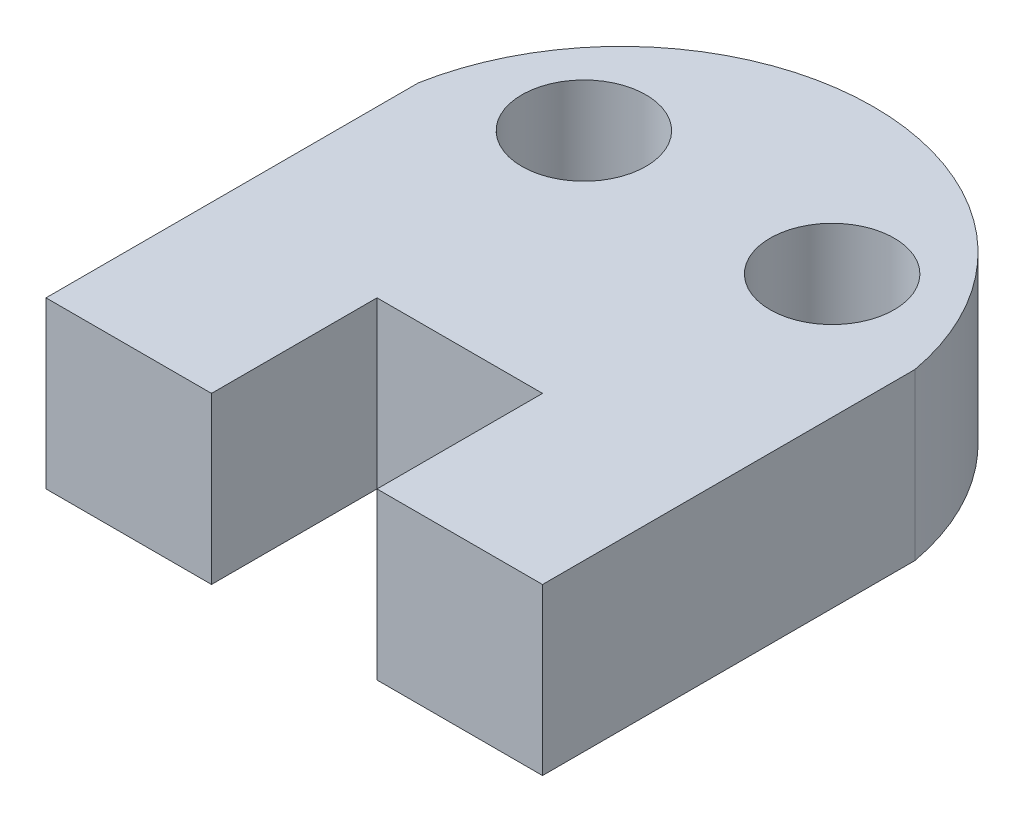
ISO-10303-21;
HEADER;
FILE_DESCRIPTION(('STEP AP214'),'2;1');
FILE_NAME('part.step','',(''),(''),'','','');
FILE_SCHEMA(('AUTOMOTIVE_DESIGN { 1 0 10303 214 1 1 1 1 }'));
ENDSEC;
DATA;
#1=APPLICATION_CONTEXT('core data for automotive mechanical design processes');
#2=APPLICATION_PROTOCOL_DEFINITION('international standard','automotive_design',2000,#1);
#3=PRODUCT_CONTEXT('',#1,'mechanical');
#4=PRODUCT('Part','Part','',(#3));
#5=PRODUCT_RELATED_PRODUCT_CATEGORY('part','',(#4));
#6=PRODUCT_DEFINITION_FORMATION('','',#4);
#7=PRODUCT_DEFINITION_CONTEXT('part definition',#1,'design');
#8=PRODUCT_DEFINITION('design','',#6,#7);
#9=PRODUCT_DEFINITION_SHAPE('','',#8);
#10=(LENGTH_UNIT() NAMED_UNIT(*) SI_UNIT(.MILLI.,.METRE.));
#11=(NAMED_UNIT(*) PLANE_ANGLE_UNIT() SI_UNIT($,.RADIAN.));
#12=(NAMED_UNIT(*) SI_UNIT($,.STERADIAN.) SOLID_ANGLE_UNIT());
#13=UNCERTAINTY_MEASURE_WITH_UNIT(LENGTH_MEASURE(1.E-05),#10,'distance_accuracy_value','');
#14=(GEOMETRIC_REPRESENTATION_CONTEXT(3) GLOBAL_UNCERTAINTY_ASSIGNED_CONTEXT((#13)) GLOBAL_UNIT_ASSIGNED_CONTEXT((#10,
#11,#12)) REPRESENTATION_CONTEXT('',''));
#15=CARTESIAN_POINT('',(0.,0.,0.));
#16=DIRECTION('',(0.,0.,1.));
#17=DIRECTION('',(1.,0.,0.));
#18=AXIS2_PLACEMENT_3D('',#15,#16,#17);
#19=CARTESIAN_POINT('',(0.,4.,0.));
#20=DIRECTION('',(0.,1.,0.));
#21=DIRECTION('',(0.,0.,1.));
#22=AXIS2_PLACEMENT_3D('',#19,#20,#21);
#23=PLANE('',#22);
#24=CARTESIAN_POINT('',(-3.,4.,-0.999999999999999));
#25=DIRECTION('',(0.,1.,0.));
#26=DIRECTION('',(0.,0.,1.));
#27=AXIS2_PLACEMENT_3D('',#24,#25,#26);
#28=CIRCLE('',#27,1.5);
#29=CARTESIAN_POINT('',(-3.,4.,0.500000000000001));
#30=VERTEX_POINT('',#29);
#31=EDGE_CURVE('E207',#30,#30,#28,.T.);
#32=ORIENTED_EDGE('',*,*,#31,.F.);
#33=EDGE_LOOP('',(#32));
#34=FACE_BOUND('',#33,.T.);
#35=CARTESIAN_POINT('',(3.,4.,-0.999999999999999));
#36=DIRECTION('',(0.,1.,0.));
#37=DIRECTION('',(0.,0.,1.));
#38=AXIS2_PLACEMENT_3D('',#35,#36,#37);
#39=CIRCLE('',#38,1.5);
#40=CARTESIAN_POINT('',(3.,4.,0.5));
#41=VERTEX_POINT('',#40);
#42=EDGE_CURVE('E184',#41,#41,#39,.T.);
#43=ORIENTED_EDGE('',*,*,#42,.F.);
#44=EDGE_LOOP('',(#43));
#45=FACE_BOUND('',#44,.T.);
#46=DIRECTION('',(0.,0.,1.));
#47=VECTOR('',#46,1.);
#48=CARTESIAN_POINT('',(6.,4.,0.));
#49=LINE('',#48,#47);
#50=CARTESIAN_POINT('',(6.,4.,0.));
#51=VERTEX_POINT('',#50);
#52=CARTESIAN_POINT('',(6.,4.,9.));
#53=VERTEX_POINT('',#52);
#54=EDGE_CURVE('E70',#51,#53,#49,.T.);
#55=ORIENTED_EDGE('',*,*,#54,.F.);
#56=CARTESIAN_POINT('',(0.,4.,1.1));
#57=DIRECTION('',(0.,1.,0.));
#58=DIRECTION('',(0.,0.,1.));
#59=AXIS2_PLACEMENT_3D('',#56,#57,#58);
#60=CIRCLE('',#59,6.1);
#61=CARTESIAN_POINT('',(-6.,4.,0.));
#62=VERTEX_POINT('',#61);
#63=EDGE_CURVE('E177',#62,#51,#60,.F.);
#64=ORIENTED_EDGE('',*,*,#63,.F.);
#65=DIRECTION('',(0.,0.,1.));
#66=VECTOR('',#65,1.);
#67=CARTESIAN_POINT('',(-6.,4.,0.));
#68=LINE('',#67,#66);
#69=CARTESIAN_POINT('',(-6.,4.,9.));
#70=VERTEX_POINT('',#69);
#71=EDGE_CURVE('E110',#62,#70,#68,.T.);
#72=ORIENTED_EDGE('',*,*,#71,.T.);
#73=DIRECTION('',(1.,0.,0.));
#74=VECTOR('',#73,1.);
#75=CARTESIAN_POINT('',(0.,4.,9.));
#76=LINE('',#75,#74);
#77=CARTESIAN_POINT('',(-2.,4.,9.));
#78=VERTEX_POINT('',#77);
#79=EDGE_CURVE('E181',#70,#78,#76,.T.);
#80=ORIENTED_EDGE('',*,*,#79,.T.);
#81=DIRECTION('',(0.,0.,-1.));
#82=VECTOR('',#81,1.);
#83=CARTESIAN_POINT('',(-2.,4.,0.));
#84=LINE('',#83,#82);
#85=CARTESIAN_POINT('',(-2.,4.,5.));
#86=VERTEX_POINT('',#85);
#87=EDGE_CURVE('E128',#78,#86,#84,.T.);
#88=ORIENTED_EDGE('',*,*,#87,.T.);
#89=DIRECTION('',(1.,0.,0.));
#90=VECTOR('',#89,1.);
#91=CARTESIAN_POINT('',(0.,4.,5.));
#92=LINE('',#91,#90);
#93=CARTESIAN_POINT('',(2.,4.,5.));
#94=VERTEX_POINT('',#93);
#95=EDGE_CURVE('E122',#86,#94,#92,.T.);
#96=ORIENTED_EDGE('',*,*,#95,.T.);
#97=DIRECTION('',(0.,0.,-1.));
#98=VECTOR('',#97,1.);
#99=CARTESIAN_POINT('',(2.,4.,0.));
#100=LINE('',#99,#98);
#101=CARTESIAN_POINT('',(2.,4.,9.));
#102=VERTEX_POINT('',#101);
#103=EDGE_CURVE('E126',#102,#94,#100,.T.);
#104=ORIENTED_EDGE('',*,*,#103,.F.);
#105=DIRECTION('',(-1.,0.,0.));
#106=VECTOR('',#105,1.);
#107=CARTESIAN_POINT('',(0.,4.,9.));
#108=LINE('',#107,#106);
#109=EDGE_CURVE('E143',#53,#102,#108,.T.);
#110=ORIENTED_EDGE('',*,*,#109,.F.);
#111=EDGE_LOOP('',(#55,#64,#72,#80,#88,#96,#104,#110));
#112=FACE_BOUND('',#111,.T.);
#113=ADVANCED_FACE('F53',(#34,#45,#112),#23,.T.);
#114=CARTESIAN_POINT('',(0.,0.,0.));
#115=DIRECTION('',(0.,1.,0.));
#116=DIRECTION('',(0.,0.,1.));
#117=AXIS2_PLACEMENT_3D('',#114,#115,#116);
#118=PLANE('',#117);
#119=CARTESIAN_POINT('',(-3.,0.,-0.999999999999999));
#120=DIRECTION('',(0.,1.,0.));
#121=DIRECTION('',(0.,0.,1.));
#122=AXIS2_PLACEMENT_3D('',#119,#120,#121);
#123=CIRCLE('',#122,1.5);
#124=CARTESIAN_POINT('',(-3.,0.,0.500000000000001));
#125=VERTEX_POINT('',#124);
#126=EDGE_CURVE('E151',#125,#125,#123,.T.);
#127=ORIENTED_EDGE('',*,*,#126,.T.);
#128=EDGE_LOOP('',(#127));
#129=FACE_BOUND('',#128,.T.);
#130=CARTESIAN_POINT('',(3.,0.,-0.999999999999999));
#131=DIRECTION('',(0.,1.,0.));
#132=DIRECTION('',(0.,0.,1.));
#133=AXIS2_PLACEMENT_3D('',#130,#131,#132);
#134=CIRCLE('',#133,1.5);
#135=CARTESIAN_POINT('',(3.,0.,0.5));
#136=VERTEX_POINT('',#135);
#137=EDGE_CURVE('E201',#136,#136,#134,.T.);
#138=ORIENTED_EDGE('',*,*,#137,.T.);
#139=EDGE_LOOP('',(#138));
#140=FACE_BOUND('',#139,.T.);
#141=CARTESIAN_POINT('',(0.,0.,1.1));
#142=DIRECTION('',(0.,1.,0.));
#143=DIRECTION('',(0.,0.,1.));
#144=AXIS2_PLACEMENT_3D('',#141,#142,#143);
#145=CIRCLE('',#144,6.1);
#146=CARTESIAN_POINT('',(-6.,0.,0.));
#147=VERTEX_POINT('',#146);
#148=CARTESIAN_POINT('',(6.,0.,0.));
#149=VERTEX_POINT('',#148);
#150=EDGE_CURVE('E194',#147,#149,#145,.F.);
#151=ORIENTED_EDGE('',*,*,#150,.T.);
#152=DIRECTION('',(0.,0.,1.));
#153=VECTOR('',#152,1.);
#154=CARTESIAN_POINT('',(6.,0.,0.));
#155=LINE('',#154,#153);
#156=CARTESIAN_POINT('',(6.,0.,9.));
#157=VERTEX_POINT('',#156);
#158=EDGE_CURVE('E102',#149,#157,#155,.T.);
#159=ORIENTED_EDGE('',*,*,#158,.T.);
#160=DIRECTION('',(-1.,0.,0.));
#161=VECTOR('',#160,1.);
#162=CARTESIAN_POINT('',(0.,0.,9.));
#163=LINE('',#162,#161);
#164=CARTESIAN_POINT('',(2.,0.,9.));
#165=VERTEX_POINT('',#164);
#166=EDGE_CURVE('E160',#157,#165,#163,.T.);
#167=ORIENTED_EDGE('',*,*,#166,.T.);
#168=DIRECTION('',(0.,0.,-1.));
#169=VECTOR('',#168,1.);
#170=CARTESIAN_POINT('',(2.,0.,0.));
#171=LINE('',#170,#169);
#172=CARTESIAN_POINT('',(2.,0.,5.));
#173=VERTEX_POINT('',#172);
#174=EDGE_CURVE('E158',#165,#173,#171,.T.);
#175=ORIENTED_EDGE('',*,*,#174,.T.);
#176=DIRECTION('',(1.,0.,0.));
#177=VECTOR('',#176,1.);
#178=CARTESIAN_POINT('',(0.,0.,5.));
#179=LINE('',#178,#177);
#180=CARTESIAN_POINT('',(-2.,0.,5.));
#181=VERTEX_POINT('',#180);
#182=EDGE_CURVE('E137',#181,#173,#179,.T.);
#183=ORIENTED_EDGE('',*,*,#182,.F.);
#184=DIRECTION('',(0.,0.,-1.));
#185=VECTOR('',#184,1.);
#186=CARTESIAN_POINT('',(-2.,0.,0.));
#187=LINE('',#186,#185);
#188=CARTESIAN_POINT('',(-2.,0.,9.));
#189=VERTEX_POINT('',#188);
#190=EDGE_CURVE('E155',#189,#181,#187,.T.);
#191=ORIENTED_EDGE('',*,*,#190,.F.);
#192=DIRECTION('',(1.,0.,0.));
#193=VECTOR('',#192,1.);
#194=CARTESIAN_POINT('',(0.,0.,9.));
#195=LINE('',#194,#193);
#196=CARTESIAN_POINT('',(-6.,0.,9.));
#197=VERTEX_POINT('',#196);
#198=EDGE_CURVE('E153',#197,#189,#195,.T.);
#199=ORIENTED_EDGE('',*,*,#198,.F.);
#200=DIRECTION('',(0.,0.,1.));
#201=VECTOR('',#200,1.);
#202=CARTESIAN_POINT('',(-6.,0.,0.));
#203=LINE('',#202,#201);
#204=EDGE_CURVE('E150',#147,#197,#203,.T.);
#205=ORIENTED_EDGE('',*,*,#204,.F.);
#206=EDGE_LOOP('',(#151,#159,#167,#175,#183,#191,#199,#205));
#207=FACE_BOUND('',#206,.T.);
#208=ADVANCED_FACE('F172',(#129,#140,#207),#118,.F.);
#209=CARTESIAN_POINT('',(6.,4.,0.));
#210=DIRECTION('',(1.,0.,0.));
#211=DIRECTION('',(0.,0.,-1.));
#212=AXIS2_PLACEMENT_3D('',#209,#210,#211);
#213=PLANE('',#212);
#214=DIRECTION('',(0.,1.,0.));
#215=VECTOR('',#214,1.);
#216=CARTESIAN_POINT('',(6.,0.,0.));
#217=LINE('',#216,#215);
#218=EDGE_CURVE('E246',#149,#51,#217,.T.);
#219=ORIENTED_EDGE('',*,*,#218,.T.);
#220=ORIENTED_EDGE('',*,*,#54,.T.);
#221=DIRECTION('',(0.,-1.,0.));
#222=VECTOR('',#221,1.);
#223=CARTESIAN_POINT('',(6.,4.,9.));
#224=LINE('',#223,#222);
#225=EDGE_CURVE('E145',#53,#157,#224,.T.);
#226=ORIENTED_EDGE('',*,*,#225,.T.);
#227=ORIENTED_EDGE('',*,*,#158,.F.);
#228=EDGE_LOOP('',(#219,#220,#226,#227));
#229=FACE_BOUND('',#228,.T.);
#230=ADVANCED_FACE('F55',(#229),#213,.T.);
#231=CARTESIAN_POINT('',(-6.,4.,0.));
#232=DIRECTION('',(1.,0.,0.));
#233=DIRECTION('',(0.,0.,-1.));
#234=AXIS2_PLACEMENT_3D('',#231,#232,#233);
#235=PLANE('',#234);
#236=ORIENTED_EDGE('',*,*,#71,.F.);
#237=DIRECTION('',(0.,1.,0.));
#238=VECTOR('',#237,1.);
#239=CARTESIAN_POINT('',(-6.,0.,0.));
#240=LINE('',#239,#238);
#241=EDGE_CURVE('E192',#147,#62,#240,.T.);
#242=ORIENTED_EDGE('',*,*,#241,.F.);
#243=ORIENTED_EDGE('',*,*,#204,.T.);
#244=DIRECTION('',(0.,-1.,0.));
#245=VECTOR('',#244,1.);
#246=CARTESIAN_POINT('',(-6.,4.,9.));
#247=LINE('',#246,#245);
#248=EDGE_CURVE('E12',#70,#197,#247,.T.);
#249=ORIENTED_EDGE('',*,*,#248,.F.);
#250=EDGE_LOOP('',(#236,#242,#243,#249));
#251=FACE_BOUND('',#250,.T.);
#252=ADVANCED_FACE('F189',(#251),#235,.F.);
#253=CARTESIAN_POINT('',(0.,4.,9.));
#254=DIRECTION('',(0.,0.,-1.));
#255=DIRECTION('',(-1.,0.,0.));
#256=AXIS2_PLACEMENT_3D('',#253,#254,#255);
#257=PLANE('',#256);
#258=ORIENTED_EDGE('',*,*,#198,.T.);
#259=DIRECTION('',(0.,-1.,0.));
#260=VECTOR('',#259,1.);
#261=CARTESIAN_POINT('',(-2.,4.,9.));
#262=LINE('',#261,#260);
#263=EDGE_CURVE('E62',#78,#189,#262,.T.);
#264=ORIENTED_EDGE('',*,*,#263,.F.);
#265=ORIENTED_EDGE('',*,*,#79,.F.);
#266=ORIENTED_EDGE('',*,*,#248,.T.);
#267=EDGE_LOOP('',(#258,#264,#265,#266));
#268=FACE_BOUND('',#267,.T.);
#269=ADVANCED_FACE('F187',(#268),#257,.F.);
#270=CARTESIAN_POINT('',(-2.,4.,0.));
#271=DIRECTION('',(-1.,0.,0.));
#272=DIRECTION('',(0.,0.,1.));
#273=AXIS2_PLACEMENT_3D('',#270,#271,#272);
#274=PLANE('',#273);
#275=ORIENTED_EDGE('',*,*,#190,.T.);
#276=DIRECTION('',(0.,-1.,0.));
#277=VECTOR('',#276,1.);
#278=CARTESIAN_POINT('',(-2.,4.,5.));
#279=LINE('',#278,#277);
#280=EDGE_CURVE('E140',#86,#181,#279,.T.);
#281=ORIENTED_EDGE('',*,*,#280,.F.);
#282=ORIENTED_EDGE('',*,*,#87,.F.);
#283=ORIENTED_EDGE('',*,*,#263,.T.);
#284=EDGE_LOOP('',(#275,#281,#282,#283));
#285=FACE_BOUND('',#284,.T.);
#286=ADVANCED_FACE('F168',(#285),#274,.F.);
#287=CARTESIAN_POINT('',(0.,4.,5.));
#288=DIRECTION('',(0.,0.,-1.));
#289=DIRECTION('',(-1.,0.,0.));
#290=AXIS2_PLACEMENT_3D('',#287,#288,#289);
#291=PLANE('',#290);
#292=ORIENTED_EDGE('',*,*,#182,.T.);
#293=DIRECTION('',(0.,-1.,0.));
#294=VECTOR('',#293,1.);
#295=CARTESIAN_POINT('',(2.,4.,5.));
#296=LINE('',#295,#294);
#297=EDGE_CURVE('E134',#94,#173,#296,.T.);
#298=ORIENTED_EDGE('',*,*,#297,.F.);
#299=ORIENTED_EDGE('',*,*,#95,.F.);
#300=ORIENTED_EDGE('',*,*,#280,.T.);
#301=EDGE_LOOP('',(#292,#298,#299,#300));
#302=FACE_BOUND('',#301,.T.);
#303=ADVANCED_FACE('F135',(#302),#291,.F.);
#304=CARTESIAN_POINT('',(2.,4.,0.));
#305=DIRECTION('',(-1.,0.,0.));
#306=DIRECTION('',(0.,0.,1.));
#307=AXIS2_PLACEMENT_3D('',#304,#305,#306);
#308=PLANE('',#307);
#309=ORIENTED_EDGE('',*,*,#174,.F.);
#310=DIRECTION('',(0.,-1.,0.));
#311=VECTOR('',#310,1.);
#312=CARTESIAN_POINT('',(2.,4.,9.));
#313=LINE('',#312,#311);
#314=EDGE_CURVE('E94',#102,#165,#313,.T.);
#315=ORIENTED_EDGE('',*,*,#314,.F.);
#316=ORIENTED_EDGE('',*,*,#103,.T.);
#317=ORIENTED_EDGE('',*,*,#297,.T.);
#318=EDGE_LOOP('',(#309,#315,#316,#317));
#319=FACE_BOUND('',#318,.T.);
#320=ADVANCED_FACE('F142',(#319),#308,.T.);
#321=CARTESIAN_POINT('',(0.,4.,9.));
#322=DIRECTION('',(0.,0.,1.));
#323=DIRECTION('',(1.,0.,0.));
#324=AXIS2_PLACEMENT_3D('',#321,#322,#323);
#325=PLANE('',#324);
#326=ORIENTED_EDGE('',*,*,#166,.F.);
#327=ORIENTED_EDGE('',*,*,#225,.F.);
#328=ORIENTED_EDGE('',*,*,#109,.T.);
#329=ORIENTED_EDGE('',*,*,#314,.T.);
#330=EDGE_LOOP('',(#326,#327,#328,#329));
#331=FACE_BOUND('',#330,.T.);
#332=ADVANCED_FACE('F174',(#331),#325,.T.);
#333=CARTESIAN_POINT('',(3.,0.,-0.999999999999999));
#334=DIRECTION('',(0.,1.,0.));
#335=DIRECTION('',(0.,0.,1.));
#336=AXIS2_PLACEMENT_3D('',#333,#334,#335);
#337=CYLINDRICAL_SURFACE('',#336,1.5);
#338=ORIENTED_EDGE('',*,*,#137,.F.);
#339=EDGE_LOOP('',(#338));
#340=FACE_BOUND('',#339,.T.);
#341=ORIENTED_EDGE('',*,*,#42,.T.);
#342=EDGE_LOOP('',(#341));
#343=FACE_BOUND('',#342,.T.);
#344=ADVANCED_FACE('F213',(#340,#343),#337,.F.);
#345=CARTESIAN_POINT('',(-3.,0.,-0.999999999999999));
#346=DIRECTION('',(0.,1.,0.));
#347=DIRECTION('',(0.,0.,1.));
#348=AXIS2_PLACEMENT_3D('',#345,#346,#347);
#349=CYLINDRICAL_SURFACE('',#348,1.5);
#350=ORIENTED_EDGE('',*,*,#126,.F.);
#351=EDGE_LOOP('',(#350));
#352=FACE_BOUND('',#351,.T.);
#353=ORIENTED_EDGE('',*,*,#31,.T.);
#354=EDGE_LOOP('',(#353));
#355=FACE_BOUND('',#354,.T.);
#356=ADVANCED_FACE('F216',(#352,#355),#349,.F.);
#357=CARTESIAN_POINT('',(0.,0.,1.1));
#358=DIRECTION('',(0.,1.,0.));
#359=DIRECTION('',(0.,0.,1.));
#360=AXIS2_PLACEMENT_3D('',#357,#358,#359);
#361=CYLINDRICAL_SURFACE('',#360,6.1);
#362=ORIENTED_EDGE('',*,*,#63,.T.);
#363=ORIENTED_EDGE('',*,*,#218,.F.);
#364=ORIENTED_EDGE('',*,*,#150,.F.);
#365=ORIENTED_EDGE('',*,*,#241,.T.);
#366=EDGE_LOOP('',(#362,#363,#364,#365));
#367=FACE_BOUND('',#366,.T.);
#368=ADVANCED_FACE('F198',(#367),#361,.T.);
#369=CLOSED_SHELL('',(#113,#208,#230,#252,#269,#286,#303,#320,#332,#344,#356,#368));
#370=MANIFOLD_SOLID_BREP('B2',#369);
#371=ADVANCED_BREP_SHAPE_REPRESENTATION('',(#18,#370),#14);
#372=SHAPE_DEFINITION_REPRESENTATION(#9,#371);
ENDSEC;
END-ISO-10303-21;
